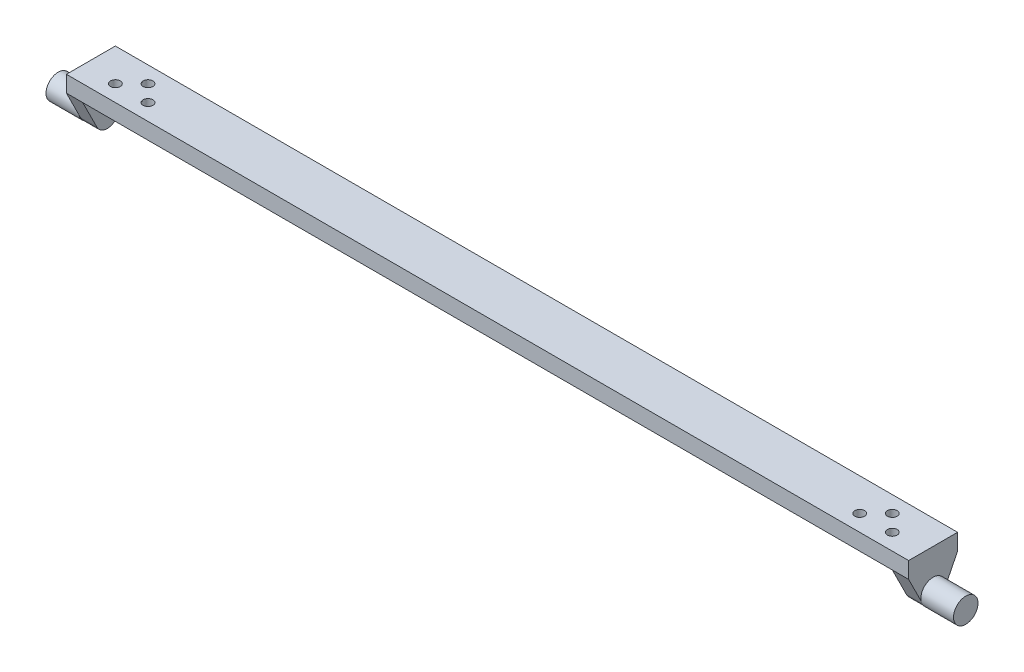
ISO-10303-21;
HEADER;
FILE_DESCRIPTION(('STEP AP214'),'2;1');
FILE_NAME('part.step','',(''),(''),'','','');
FILE_SCHEMA(('AUTOMOTIVE_DESIGN { 1 0 10303 214 1 1 1 1 }'));
ENDSEC;
DATA;
#1=APPLICATION_CONTEXT('core data for automotive mechanical design processes');
#2=APPLICATION_PROTOCOL_DEFINITION('international standard','automotive_design',2000,#1);
#3=PRODUCT_CONTEXT('',#1,'mechanical');
#4=PRODUCT('Part','Part','',(#3));
#5=PRODUCT_RELATED_PRODUCT_CATEGORY('part','',(#4));
#6=PRODUCT_DEFINITION_FORMATION('','',#4);
#7=PRODUCT_DEFINITION_CONTEXT('part definition',#1,'design');
#8=PRODUCT_DEFINITION('design','',#6,#7);
#9=PRODUCT_DEFINITION_SHAPE('','',#8);
#10=(LENGTH_UNIT() NAMED_UNIT(*) SI_UNIT(.MILLI.,.METRE.));
#11=(NAMED_UNIT(*) PLANE_ANGLE_UNIT() SI_UNIT($,.RADIAN.));
#12=(NAMED_UNIT(*) SI_UNIT($,.STERADIAN.) SOLID_ANGLE_UNIT());
#13=UNCERTAINTY_MEASURE_WITH_UNIT(LENGTH_MEASURE(1.E-05),#10,'distance_accuracy_value','');
#14=(GEOMETRIC_REPRESENTATION_CONTEXT(3) GLOBAL_UNCERTAINTY_ASSIGNED_CONTEXT((#13)) GLOBAL_UNIT_ASSIGNED_CONTEXT((#10,
#11,#12)) REPRESENTATION_CONTEXT('',''));
#15=CARTESIAN_POINT('',(0.,0.,0.));
#16=DIRECTION('',(0.,0.,1.));
#17=DIRECTION('',(1.,0.,0.));
#18=AXIS2_PLACEMENT_3D('',#15,#16,#17);
#19=CARTESIAN_POINT('',(-52.3880758683504,0.,0.));
#20=DIRECTION('',(1.,0.,0.));
#21=DIRECTION('',(0.,0.,-1.));
#22=AXIS2_PLACEMENT_3D('',#19,#20,#21);
#23=PLANE('',#22);
#24=CARTESIAN_POINT('',(-52.3880758683504,-6.92376207875074,7.16574015094486));
#25=DIRECTION('',(-1.,0.,0.));
#26=DIRECTION('',(0.,0.,1.));
#27=AXIS2_PLACEMENT_3D('',#24,#25,#26);
#28=CIRCLE('',#27,3.75);
#29=CARTESIAN_POINT('',(-52.3880758683504,-7.63684506255339,10.8473176196682));
#30=VERTEX_POINT('',#29);
#31=CARTESIAN_POINT('',(-52.3880758683504,-7.63684506255339,3.48416268222155));
#32=VERTEX_POINT('',#31);
#33=EDGE_CURVE('E11',#30,#32,#28,.T.);
#34=ORIENTED_EDGE('',*,*,#33,.F.);
#35=DIRECTION('',(0.,0.894427190999916,0.447213595499958));
#36=VECTOR('',#35,1.);
#37=CARTESIAN_POINT('',(-52.3880758683504,0.,14.6657401509449));
#38=LINE('',#37,#36);
#39=CARTESIAN_POINT('',(-52.3880758683504,0.,14.6657401509449));
#40=VERTEX_POINT('',#39);
#41=EDGE_CURVE('E137',#30,#40,#38,.T.);
#42=ORIENTED_EDGE('',*,*,#41,.T.);
#43=DIRECTION('',(0.,1.,0.));
#44=VECTOR('',#43,1.);
#45=CARTESIAN_POINT('',(-52.3880758683504,5.,14.6657401509449));
#46=LINE('',#45,#44);
#47=CARTESIAN_POINT('',(-52.3880758683504,5.,14.6657401509449));
#48=VERTEX_POINT('',#47);
#49=EDGE_CURVE('E162',#40,#48,#46,.T.);
#50=ORIENTED_EDGE('',*,*,#49,.T.);
#51=DIRECTION('',(0.,0.,-1.));
#52=VECTOR('',#51,1.);
#53=CARTESIAN_POINT('',(-52.3880758683504,5.,-0.33425984905514));
#54=LINE('',#53,#52);
#55=CARTESIAN_POINT('',(-52.3880758683504,5.,-0.33425984905514));
#56=VERTEX_POINT('',#55);
#57=EDGE_CURVE('E165',#48,#56,#54,.T.);
#58=ORIENTED_EDGE('',*,*,#57,.T.);
#59=DIRECTION('',(0.,-1.,0.));
#60=VECTOR('',#59,1.);
#61=CARTESIAN_POINT('',(-52.3880758683504,0.,-0.33425984905514));
#62=LINE('',#61,#60);
#63=CARTESIAN_POINT('',(-52.3880758683504,0.,-0.33425984905514));
#64=VERTEX_POINT('',#63);
#65=EDGE_CURVE('E133',#56,#64,#62,.T.);
#66=ORIENTED_EDGE('',*,*,#65,.T.);
#67=DIRECTION('',(0.,-0.894427190999916,0.447213595499958));
#68=VECTOR('',#67,1.);
#69=CARTESIAN_POINT('',(-52.3880758683504,-15.,7.16574015094486));
#70=LINE('',#69,#68);
#71=EDGE_CURVE('E129',#64,#32,#70,.T.);
#72=ORIENTED_EDGE('',*,*,#71,.T.);
#73=EDGE_LOOP('',(#34,#42,#50,#58,#66,#72));
#74=FACE_BOUND('',#73,.T.);
#75=ADVANCED_FACE('F33',(#74),#23,.F.);
#76=CARTESIAN_POINT('',(200.61192413165,5.,-0.334259849055131));
#77=DIRECTION('',(0.,0.,1.));
#78=DIRECTION('',(1.,0.,0.));
#79=AXIS2_PLACEMENT_3D('',#76,#77,#78);
#80=PLANE('',#79);
#81=DIRECTION('',(-1.,0.,0.));
#82=VECTOR('',#81,1.);
#83=CARTESIAN_POINT('',(200.61192413165,0.,-0.334259849055131));
#84=LINE('',#83,#82);
#85=CARTESIAN_POINT('',(200.61192413165,0.,-0.334259849055131));
#86=VERTEX_POINT('',#85);
#87=CARTESIAN_POINT('',(-47.3880758683504,0.,-0.33425984905514));
#88=VERTEX_POINT('',#87);
#89=EDGE_CURVE('E243',#86,#88,#84,.T.);
#90=ORIENTED_EDGE('',*,*,#89,.T.);
#91=DIRECTION('',(1.,0.,0.));
#92=VECTOR('',#91,1.);
#93=CARTESIAN_POINT('',(-52.3880758683504,0.,-0.33425984905514));
#94=LINE('',#93,#92);
#95=EDGE_CURVE('E168',#64,#88,#94,.T.);
#96=ORIENTED_EDGE('',*,*,#95,.F.);
#97=ORIENTED_EDGE('',*,*,#65,.F.);
#98=DIRECTION('',(-1.,0.,0.));
#99=VECTOR('',#98,1.);
#100=CARTESIAN_POINT('',(200.61192413165,5.,-0.334259849055131));
#101=LINE('',#100,#99);
#102=CARTESIAN_POINT('',(205.61192413165,5.,-0.334259849055131));
#103=VERTEX_POINT('',#102);
#104=EDGE_CURVE('E246',#103,#56,#101,.T.);
#105=ORIENTED_EDGE('',*,*,#104,.F.);
#106=DIRECTION('',(0.,1.,0.));
#107=VECTOR('',#106,1.);
#108=CARTESIAN_POINT('',(205.61192413165,0.,-0.334259849055131));
#109=LINE('',#108,#107);
#110=CARTESIAN_POINT('',(205.61192413165,0.,-0.334259849055131));
#111=VERTEX_POINT('',#110);
#112=EDGE_CURVE('E187',#111,#103,#109,.T.);
#113=ORIENTED_EDGE('',*,*,#112,.F.);
#114=DIRECTION('',(-1.,0.,0.));
#115=VECTOR('',#114,1.);
#116=CARTESIAN_POINT('',(205.61192413165,0.,-0.334259849055131));
#117=LINE('',#116,#115);
#118=EDGE_CURVE('E206',#111,#86,#117,.T.);
#119=ORIENTED_EDGE('',*,*,#118,.T.);
#120=EDGE_LOOP('',(#90,#96,#97,#105,#113,#119));
#121=FACE_BOUND('',#120,.T.);
#122=ADVANCED_FACE('F285',(#121),#80,.F.);
#123=CARTESIAN_POINT('',(-47.3880758683504,5.,14.6657401509449));
#124=DIRECTION('',(0.,0.,-1.));
#125=DIRECTION('',(-1.,0.,0.));
#126=AXIS2_PLACEMENT_3D('',#123,#124,#125);
#127=PLANE('',#126);
#128=DIRECTION('',(1.,0.,0.));
#129=VECTOR('',#128,1.);
#130=CARTESIAN_POINT('',(-47.3880758683504,0.,14.6657401509449));
#131=LINE('',#130,#129);
#132=CARTESIAN_POINT('',(-47.3880758683504,0.,14.6657401509449));
#133=VERTEX_POINT('',#132);
#134=CARTESIAN_POINT('',(200.61192413165,0.,14.6657401509449));
#135=VERTEX_POINT('',#134);
#136=EDGE_CURVE('E257',#133,#135,#131,.T.);
#137=ORIENTED_EDGE('',*,*,#136,.T.);
#138=DIRECTION('',(-1.,0.,0.));
#139=VECTOR('',#138,1.);
#140=CARTESIAN_POINT('',(205.61192413165,0.,14.6657401509449));
#141=LINE('',#140,#139);
#142=CARTESIAN_POINT('',(205.61192413165,0.,14.6657401509449));
#143=VERTEX_POINT('',#142);
#144=EDGE_CURVE('E199',#143,#135,#141,.T.);
#145=ORIENTED_EDGE('',*,*,#144,.F.);
#146=DIRECTION('',(0.,-1.,0.));
#147=VECTOR('',#146,1.);
#148=CARTESIAN_POINT('',(205.61192413165,5.,14.6657401509449));
#149=LINE('',#148,#147);
#150=CARTESIAN_POINT('',(205.61192413165,5.,14.6657401509449));
#151=VERTEX_POINT('',#150);
#152=EDGE_CURVE('E194',#151,#143,#149,.T.);
#153=ORIENTED_EDGE('',*,*,#152,.F.);
#154=DIRECTION('',(1.,0.,0.));
#155=VECTOR('',#154,1.);
#156=CARTESIAN_POINT('',(-47.3880758683504,5.,14.6657401509449));
#157=LINE('',#156,#155);
#158=EDGE_CURVE('E248',#48,#151,#157,.T.);
#159=ORIENTED_EDGE('',*,*,#158,.F.);
#160=ORIENTED_EDGE('',*,*,#49,.F.);
#161=DIRECTION('',(1.,0.,0.));
#162=VECTOR('',#161,1.);
#163=CARTESIAN_POINT('',(-52.3880758683504,0.,14.6657401509449));
#164=LINE('',#163,#162);
#165=EDGE_CURVE('E172',#40,#133,#164,.T.);
#166=ORIENTED_EDGE('',*,*,#165,.T.);
#167=EDGE_LOOP('',(#137,#145,#153,#159,#160,#166));
#168=FACE_BOUND('',#167,.T.);
#169=ADVANCED_FACE('F340',(#168),#127,.F.);
#170=CARTESIAN_POINT('',(0.,5.,0.));
#171=DIRECTION('',(0.,1.,0.));
#172=DIRECTION('',(0.,0.,1.));
#173=AXIS2_PLACEMENT_3D('',#170,#171,#172);
#174=PLANE('',#173);
#175=CARTESIAN_POINT('',(195.61192413165,5.,9.66574015094486));
#176=DIRECTION('',(0.,1.,0.));
#177=DIRECTION('',(0.,0.,1.));
#178=AXIS2_PLACEMENT_3D('',#175,#176,#177);
#179=CIRCLE('',#178,1.5);
#180=CARTESIAN_POINT('',(195.61192413165,5.,11.1657401509449));
#181=VERTEX_POINT('',#180);
#182=EDGE_CURVE('E209',#181,#181,#179,.T.);
#183=ORIENTED_EDGE('',*,*,#182,.F.);
#184=EDGE_LOOP('',(#183));
#185=FACE_BOUND('',#184,.T.);
#186=CARTESIAN_POINT('',(190.61192413165,5.,4.66574015094487));
#187=DIRECTION('',(0.,1.,0.));
#188=DIRECTION('',(0.,0.,1.));
#189=AXIS2_PLACEMENT_3D('',#186,#187,#188);
#190=CIRCLE('',#189,1.5);
#191=CARTESIAN_POINT('',(190.61192413165,5.,6.16574015094487));
#192=VERTEX_POINT('',#191);
#193=EDGE_CURVE('E213',#192,#192,#190,.T.);
#194=ORIENTED_EDGE('',*,*,#193,.F.);
#195=EDGE_LOOP('',(#194));
#196=FACE_BOUND('',#195,.T.);
#197=CARTESIAN_POINT('',(185.61192413165,5.,9.66574015094486));
#198=DIRECTION('',(0.,1.,0.));
#199=DIRECTION('',(0.,0.,1.));
#200=AXIS2_PLACEMENT_3D('',#197,#198,#199);
#201=CIRCLE('',#200,1.5);
#202=CARTESIAN_POINT('',(185.61192413165,5.,11.1657401509449));
#203=VERTEX_POINT('',#202);
#204=EDGE_CURVE('E219',#203,#203,#201,.T.);
#205=ORIENTED_EDGE('',*,*,#204,.F.);
#206=EDGE_LOOP('',(#205));
#207=FACE_BOUND('',#206,.T.);
#208=CARTESIAN_POINT('',(-32.3880758683504,5.,9.66574015094486));
#209=DIRECTION('',(0.,1.,0.));
#210=DIRECTION('',(0.,0.,1.));
#211=AXIS2_PLACEMENT_3D('',#208,#209,#210);
#212=CIRCLE('',#211,1.5);
#213=CARTESIAN_POINT('',(-32.3880758683504,5.,11.1657401509449));
#214=VERTEX_POINT('',#213);
#215=EDGE_CURVE('E225',#214,#214,#212,.T.);
#216=ORIENTED_EDGE('',*,*,#215,.F.);
#217=EDGE_LOOP('',(#216));
#218=FACE_BOUND('',#217,.T.);
#219=CARTESIAN_POINT('',(-37.3880758683504,5.,4.66574015094487));
#220=DIRECTION('',(0.,1.,0.));
#221=DIRECTION('',(0.,0.,1.));
#222=AXIS2_PLACEMENT_3D('',#219,#220,#221);
#223=CIRCLE('',#222,1.5);
#224=CARTESIAN_POINT('',(-37.3880758683504,5.,6.16574015094487));
#225=VERTEX_POINT('',#224);
#226=EDGE_CURVE('E231',#225,#225,#223,.T.);
#227=ORIENTED_EDGE('',*,*,#226,.F.);
#228=EDGE_LOOP('',(#227));
#229=FACE_BOUND('',#228,.T.);
#230=CARTESIAN_POINT('',(-42.3880758683504,5.,9.66574015094486));
#231=DIRECTION('',(0.,1.,0.));
#232=DIRECTION('',(0.,0.,1.));
#233=AXIS2_PLACEMENT_3D('',#230,#231,#232);
#234=CIRCLE('',#233,1.5);
#235=CARTESIAN_POINT('',(-42.3880758683504,5.,11.1657401509449));
#236=VERTEX_POINT('',#235);
#237=EDGE_CURVE('E237',#236,#236,#234,.T.);
#238=ORIENTED_EDGE('',*,*,#237,.F.);
#239=EDGE_LOOP('',(#238));
#240=FACE_BOUND('',#239,.T.);
#241=ORIENTED_EDGE('',*,*,#104,.T.);
#242=ORIENTED_EDGE('',*,*,#57,.F.);
#243=ORIENTED_EDGE('',*,*,#158,.T.);
#244=DIRECTION('',(0.,0.,1.));
#245=VECTOR('',#244,1.);
#246=CARTESIAN_POINT('',(205.61192413165,5.,-0.334259849055131));
#247=LINE('',#246,#245);
#248=EDGE_CURVE('E191',#103,#151,#247,.T.);
#249=ORIENTED_EDGE('',*,*,#248,.F.);
#250=EDGE_LOOP('',(#241,#242,#243,#249));
#251=FACE_BOUND('',#250,.T.);
#252=ADVANCED_FACE('F423',(#185,#196,#207,#218,#229,#240,#251),#174,.T.);
#253=CARTESIAN_POINT('',(0.,0.,0.));
#254=DIRECTION('',(0.,1.,0.));
#255=DIRECTION('',(0.,0.,1.));
#256=AXIS2_PLACEMENT_3D('',#253,#254,#255);
#257=PLANE('',#256);
#258=CARTESIAN_POINT('',(195.61192413165,0.,9.66574015094486));
#259=DIRECTION('',(0.,1.,0.));
#260=DIRECTION('',(0.,0.,1.));
#261=AXIS2_PLACEMENT_3D('',#258,#259,#260);
#262=CIRCLE('',#261,1.5);
#263=CARTESIAN_POINT('',(195.61192413165,0.,11.1657401509449));
#264=VERTEX_POINT('',#263);
#265=EDGE_CURVE('E210',#264,#264,#262,.T.);
#266=ORIENTED_EDGE('',*,*,#265,.T.);
#267=EDGE_LOOP('',(#266));
#268=FACE_BOUND('',#267,.T.);
#269=CARTESIAN_POINT('',(190.61192413165,0.,4.66574015094487));
#270=DIRECTION('',(0.,1.,0.));
#271=DIRECTION('',(0.,0.,1.));
#272=AXIS2_PLACEMENT_3D('',#269,#270,#271);
#273=CIRCLE('',#272,1.5);
#274=CARTESIAN_POINT('',(190.61192413165,0.,6.16574015094487));
#275=VERTEX_POINT('',#274);
#276=EDGE_CURVE('E216',#275,#275,#273,.T.);
#277=ORIENTED_EDGE('',*,*,#276,.T.);
#278=EDGE_LOOP('',(#277));
#279=FACE_BOUND('',#278,.T.);
#280=CARTESIAN_POINT('',(185.61192413165,0.,9.66574015094486));
#281=DIRECTION('',(0.,1.,0.));
#282=DIRECTION('',(0.,0.,1.));
#283=AXIS2_PLACEMENT_3D('',#280,#281,#282);
#284=CIRCLE('',#283,1.5);
#285=CARTESIAN_POINT('',(185.61192413165,0.,11.1657401509449));
#286=VERTEX_POINT('',#285);
#287=EDGE_CURVE('E222',#286,#286,#284,.T.);
#288=ORIENTED_EDGE('',*,*,#287,.T.);
#289=EDGE_LOOP('',(#288));
#290=FACE_BOUND('',#289,.T.);
#291=CARTESIAN_POINT('',(-32.3880758683504,0.,9.66574015094486));
#292=DIRECTION('',(0.,1.,0.));
#293=DIRECTION('',(0.,0.,1.));
#294=AXIS2_PLACEMENT_3D('',#291,#292,#293);
#295=CIRCLE('',#294,1.5);
#296=CARTESIAN_POINT('',(-32.3880758683504,0.,11.1657401509449));
#297=VERTEX_POINT('',#296);
#298=EDGE_CURVE('E228',#297,#297,#295,.T.);
#299=ORIENTED_EDGE('',*,*,#298,.T.);
#300=EDGE_LOOP('',(#299));
#301=FACE_BOUND('',#300,.T.);
#302=CARTESIAN_POINT('',(-37.3880758683504,0.,4.66574015094487));
#303=DIRECTION('',(0.,1.,0.));
#304=DIRECTION('',(0.,0.,1.));
#305=AXIS2_PLACEMENT_3D('',#302,#303,#304);
#306=CIRCLE('',#305,1.5);
#307=CARTESIAN_POINT('',(-37.3880758683504,0.,6.16574015094487));
#308=VERTEX_POINT('',#307);
#309=EDGE_CURVE('E234',#308,#308,#306,.T.);
#310=ORIENTED_EDGE('',*,*,#309,.T.);
#311=EDGE_LOOP('',(#310));
#312=FACE_BOUND('',#311,.T.);
#313=CARTESIAN_POINT('',(-42.3880758683504,0.,9.66574015094486));
#314=DIRECTION('',(0.,1.,0.));
#315=DIRECTION('',(0.,0.,1.));
#316=AXIS2_PLACEMENT_3D('',#313,#314,#315);
#317=CIRCLE('',#316,1.5);
#318=CARTESIAN_POINT('',(-42.3880758683504,0.,11.1657401509449));
#319=VERTEX_POINT('',#318);
#320=EDGE_CURVE('E240',#319,#319,#317,.T.);
#321=ORIENTED_EDGE('',*,*,#320,.T.);
#322=EDGE_LOOP('',(#321));
#323=FACE_BOUND('',#322,.T.);
#324=ORIENTED_EDGE('',*,*,#89,.F.);
#325=DIRECTION('',(0.,0.,-1.));
#326=VECTOR('',#325,1.);
#327=CARTESIAN_POINT('',(200.61192413165,0.,14.6657401509449));
#328=LINE('',#327,#326);
#329=EDGE_CURVE('E249',#135,#86,#328,.T.);
#330=ORIENTED_EDGE('',*,*,#329,.F.);
#331=ORIENTED_EDGE('',*,*,#136,.F.);
#332=DIRECTION('',(0.,0.,1.));
#333=VECTOR('',#332,1.);
#334=CARTESIAN_POINT('',(-47.3880758683504,0.,-0.33425984905514));
#335=LINE('',#334,#333);
#336=EDGE_CURVE('E254',#88,#133,#335,.T.);
#337=ORIENTED_EDGE('',*,*,#336,.F.);
#338=EDGE_LOOP('',(#324,#330,#331,#337));
#339=FACE_BOUND('',#338,.T.);
#340=ADVANCED_FACE('F291',(#268,#279,#290,#301,#312,#323,#339),#257,.F.);
#341=CARTESIAN_POINT('',(-42.3880758683504,0.,9.66574015094486));
#342=DIRECTION('',(0.,1.,0.));
#343=DIRECTION('',(0.,0.,1.));
#344=AXIS2_PLACEMENT_3D('',#341,#342,#343);
#345=CYLINDRICAL_SURFACE('',#344,1.5);
#346=ORIENTED_EDGE('',*,*,#320,.F.);
#347=EDGE_LOOP('',(#346));
#348=FACE_BOUND('',#347,.T.);
#349=ORIENTED_EDGE('',*,*,#237,.T.);
#350=EDGE_LOOP('',(#349));
#351=FACE_BOUND('',#350,.T.);
#352=ADVANCED_FACE('F550',(#348,#351),#345,.F.);
#353=CARTESIAN_POINT('',(-37.3880758683504,0.,4.66574015094487));
#354=DIRECTION('',(0.,1.,0.));
#355=DIRECTION('',(0.,0.,1.));
#356=AXIS2_PLACEMENT_3D('',#353,#354,#355);
#357=CYLINDRICAL_SURFACE('',#356,1.5);
#358=ORIENTED_EDGE('',*,*,#309,.F.);
#359=EDGE_LOOP('',(#358));
#360=FACE_BOUND('',#359,.T.);
#361=ORIENTED_EDGE('',*,*,#226,.T.);
#362=EDGE_LOOP('',(#361));
#363=FACE_BOUND('',#362,.T.);
#364=ADVANCED_FACE('F540',(#360,#363),#357,.F.);
#365=CARTESIAN_POINT('',(-32.3880758683504,0.,9.66574015094486));
#366=DIRECTION('',(0.,1.,0.));
#367=DIRECTION('',(0.,0.,1.));
#368=AXIS2_PLACEMENT_3D('',#365,#366,#367);
#369=CYLINDRICAL_SURFACE('',#368,1.5);
#370=ORIENTED_EDGE('',*,*,#298,.F.);
#371=EDGE_LOOP('',(#370));
#372=FACE_BOUND('',#371,.T.);
#373=ORIENTED_EDGE('',*,*,#215,.T.);
#374=EDGE_LOOP('',(#373));
#375=FACE_BOUND('',#374,.T.);
#376=ADVANCED_FACE('F530',(#372,#375),#369,.F.);
#377=CARTESIAN_POINT('',(185.61192413165,0.,9.66574015094486));
#378=DIRECTION('',(0.,1.,0.));
#379=DIRECTION('',(0.,0.,1.));
#380=AXIS2_PLACEMENT_3D('',#377,#378,#379);
#381=CYLINDRICAL_SURFACE('',#380,1.5);
#382=ORIENTED_EDGE('',*,*,#287,.F.);
#383=EDGE_LOOP('',(#382));
#384=FACE_BOUND('',#383,.T.);
#385=ORIENTED_EDGE('',*,*,#204,.T.);
#386=EDGE_LOOP('',(#385));
#387=FACE_BOUND('',#386,.T.);
#388=ADVANCED_FACE('F520',(#384,#387),#381,.F.);
#389=CARTESIAN_POINT('',(190.61192413165,0.,4.66574015094487));
#390=DIRECTION('',(0.,1.,0.));
#391=DIRECTION('',(0.,0.,1.));
#392=AXIS2_PLACEMENT_3D('',#389,#390,#391);
#393=CYLINDRICAL_SURFACE('',#392,1.5);
#394=ORIENTED_EDGE('',*,*,#276,.F.);
#395=EDGE_LOOP('',(#394));
#396=FACE_BOUND('',#395,.T.);
#397=ORIENTED_EDGE('',*,*,#193,.T.);
#398=EDGE_LOOP('',(#397));
#399=FACE_BOUND('',#398,.T.);
#400=ADVANCED_FACE('F510',(#396,#399),#393,.F.);
#401=CARTESIAN_POINT('',(195.61192413165,0.,9.66574015094486));
#402=DIRECTION('',(0.,1.,0.));
#403=DIRECTION('',(0.,0.,1.));
#404=AXIS2_PLACEMENT_3D('',#401,#402,#403);
#405=CYLINDRICAL_SURFACE('',#404,1.5);
#406=ORIENTED_EDGE('',*,*,#265,.F.);
#407=EDGE_LOOP('',(#406));
#408=FACE_BOUND('',#407,.T.);
#409=ORIENTED_EDGE('',*,*,#182,.T.);
#410=EDGE_LOOP('',(#409));
#411=FACE_BOUND('',#410,.T.);
#412=ADVANCED_FACE('F503',(#408,#411),#405,.F.);
#413=CARTESIAN_POINT('',(200.61192413165,0.,0.));
#414=DIRECTION('',(1.,0.,0.));
#415=DIRECTION('',(0.,0.,-1.));
#416=AXIS2_PLACEMENT_3D('',#413,#414,#415);
#417=PLANE('',#416);
#418=DIRECTION('',(0.,0.894427190999916,-0.447213595499958));
#419=VECTOR('',#418,1.);
#420=CARTESIAN_POINT('',(200.61192413165,-15.,7.16574015094487));
#421=LINE('',#420,#419);
#422=CARTESIAN_POINT('',(200.61192413165,-8.73900966300059,4.03524498244516));
#423=VERTEX_POINT('',#422);
#424=EDGE_CURVE('E179',#423,#86,#421,.T.);
#425=ORIENTED_EDGE('',*,*,#424,.F.);
#426=CARTESIAN_POINT('',(200.61192413165,-7.17376207875073,7.16574015094487));
#427=DIRECTION('',(1.,0.,0.));
#428=DIRECTION('',(0.,0.,-1.));
#429=AXIS2_PLACEMENT_3D('',#426,#427,#428);
#430=CIRCLE('',#429,3.5);
#431=CARTESIAN_POINT('',(200.61192413165,-8.73900966300059,10.2962353194446));
#432=VERTEX_POINT('',#431);
#433=EDGE_CURVE('E263',#423,#432,#430,.F.);
#434=ORIENTED_EDGE('',*,*,#433,.T.);
#435=DIRECTION('',(0.,-0.894427190999916,-0.447213595499958));
#436=VECTOR('',#435,1.);
#437=CARTESIAN_POINT('',(200.61192413165,0.,14.6657401509449));
#438=LINE('',#437,#436);
#439=EDGE_CURVE('E201',#135,#432,#438,.T.);
#440=ORIENTED_EDGE('',*,*,#439,.F.);
#441=ORIENTED_EDGE('',*,*,#329,.T.);
#442=EDGE_LOOP('',(#425,#434,#440,#441));
#443=FACE_BOUND('',#442,.T.);
#444=ADVANCED_FACE('F296',(#443),#417,.F.);
#445=CARTESIAN_POINT('',(205.61192413165,-15.,7.16574015094487));
#446=DIRECTION('',(0.,0.447213595499958,0.894427190999916));
#447=DIRECTION('',(0.,-0.894427190999916,0.447213595499958));
#448=AXIS2_PLACEMENT_3D('',#445,#446,#447);
#449=PLANE('',#448);
#450=DIRECTION('',(0.,0.894427190999916,-0.447213595499958));
#451=VECTOR('',#450,1.);
#452=CARTESIAN_POINT('',(205.61192413165,-15.,7.16574015094487));
#453=LINE('',#452,#451);
#454=CARTESIAN_POINT('',(205.61192413165,-8.73900966300059,4.03524498244516));
#455=VERTEX_POINT('',#454);
#456=CARTESIAN_POINT('',(205.61192413165,-7.63684506255339,3.48416268222156));
#457=VERTEX_POINT('',#456);
#458=EDGE_CURVE('E184',#455,#457,#453,.T.);
#459=ORIENTED_EDGE('',*,*,#458,.F.);
#460=DIRECTION('',(-1.,0.,0.));
#461=VECTOR('',#460,1.);
#462=CARTESIAN_POINT('',(205.61192413165,-8.73900966300059,4.03524498244516));
#463=LINE('',#462,#461);
#464=EDGE_CURVE('E251',#455,#423,#463,.T.);
#465=ORIENTED_EDGE('',*,*,#464,.T.);
#466=ORIENTED_EDGE('',*,*,#424,.T.);
#467=ORIENTED_EDGE('',*,*,#118,.F.);
#468=EDGE_CURVE('E188',#457,#111,#453,.T.);
#469=ORIENTED_EDGE('',*,*,#468,.F.);
#470=EDGE_LOOP('',(#459,#465,#466,#467,#469));
#471=FACE_BOUND('',#470,.T.);
#472=ADVANCED_FACE('F321',(#471),#449,.F.);
#473=CARTESIAN_POINT('',(205.61192413165,0.,14.6657401509449));
#474=DIRECTION('',(0.,0.447213595499958,-0.894427190999916));
#475=DIRECTION('',(0.,0.894427190999916,0.447213595499958));
#476=AXIS2_PLACEMENT_3D('',#473,#474,#475);
#477=PLANE('',#476);
#478=ORIENTED_EDGE('',*,*,#439,.T.);
#479=DIRECTION('',(-1.,0.,0.));
#480=VECTOR('',#479,1.);
#481=CARTESIAN_POINT('',(205.61192413165,-8.73900966300059,10.2962353194446));
#482=LINE('',#481,#480);
#483=CARTESIAN_POINT('',(205.61192413165,-8.73900966300059,10.2962353194446));
#484=VERTEX_POINT('',#483);
#485=EDGE_CURVE('E265',#432,#484,#482,.F.);
#486=ORIENTED_EDGE('',*,*,#485,.T.);
#487=DIRECTION('',(0.,-0.894427190999916,-0.447213595499958));
#488=VECTOR('',#487,1.);
#489=CARTESIAN_POINT('',(205.61192413165,0.,14.6657401509449));
#490=LINE('',#489,#488);
#491=CARTESIAN_POINT('',(205.61192413165,-7.63684506255339,10.8473176196682));
#492=VERTEX_POINT('',#491);
#493=EDGE_CURVE('E196',#492,#484,#490,.T.);
#494=ORIENTED_EDGE('',*,*,#493,.F.);
#495=EDGE_CURVE('E197',#143,#492,#490,.T.);
#496=ORIENTED_EDGE('',*,*,#495,.F.);
#497=ORIENTED_EDGE('',*,*,#144,.T.);
#498=EDGE_LOOP('',(#478,#486,#494,#496,#497));
#499=FACE_BOUND('',#498,.T.);
#500=ADVANCED_FACE('F299',(#499),#477,.F.);
#501=CARTESIAN_POINT('',(205.61192413165,0.,0.));
#502=DIRECTION('',(1.,0.,0.));
#503=DIRECTION('',(0.,0.,-1.));
#504=AXIS2_PLACEMENT_3D('',#501,#502,#503);
#505=PLANE('',#504);
#506=CARTESIAN_POINT('',(205.61192413165,-6.92376207875073,7.16574015094487));
#507=DIRECTION('',(1.,0.,0.));
#508=DIRECTION('',(0.,0.,-1.));
#509=AXIS2_PLACEMENT_3D('',#506,#507,#508);
#510=CIRCLE('',#509,3.75);
#511=EDGE_CURVE('E183',#457,#492,#510,.T.);
#512=ORIENTED_EDGE('',*,*,#511,.F.);
#513=ORIENTED_EDGE('',*,*,#468,.T.);
#514=ORIENTED_EDGE('',*,*,#112,.T.);
#515=ORIENTED_EDGE('',*,*,#248,.T.);
#516=ORIENTED_EDGE('',*,*,#152,.T.);
#517=ORIENTED_EDGE('',*,*,#495,.T.);
#518=EDGE_LOOP('',(#512,#513,#514,#515,#516,#517));
#519=FACE_BOUND('',#518,.T.);
#520=ADVANCED_FACE('F319',(#519),#505,.T.);
#521=CARTESIAN_POINT('',(205.61192413165,-7.17376207875073,7.16574015094487));
#522=DIRECTION('',(-1.,0.,0.));
#523=DIRECTION('',(0.,0.,1.));
#524=AXIS2_PLACEMENT_3D('',#521,#522,#523);
#525=CYLINDRICAL_SURFACE('',#524,3.5);
#526=CARTESIAN_POINT('',(205.61192413165,-7.17376207875073,7.16574015094487));
#527=DIRECTION('',(1.,0.,0.));
#528=DIRECTION('',(0.,0.,-1.));
#529=AXIS2_PLACEMENT_3D('',#526,#527,#528);
#530=CIRCLE('',#529,3.5);
#531=CARTESIAN_POINT('',(205.61192413165,-10.6737620787507,7.16574015094488));
#532=VERTEX_POINT('',#531);
#533=EDGE_CURVE('E268',#484,#532,#530,.T.);
#534=ORIENTED_EDGE('',*,*,#533,.F.);
#535=ORIENTED_EDGE('',*,*,#485,.F.);
#536=ORIENTED_EDGE('',*,*,#433,.F.);
#537=ORIENTED_EDGE('',*,*,#464,.F.);
#538=EDGE_CURVE('E267',#532,#455,#530,.T.);
#539=ORIENTED_EDGE('',*,*,#538,.F.);
#540=EDGE_LOOP('',(#534,#535,#536,#537,#539));
#541=FACE_BOUND('',#540,.T.);
#542=ADVANCED_FACE('F305',(#541),#525,.T.);
#543=CARTESIAN_POINT('',(205.61192413165,-6.92376207875073,7.16574015094487));
#544=DIRECTION('',(1.,0.,0.));
#545=DIRECTION('',(0.,0.,-1.));
#546=AXIS2_PLACEMENT_3D('',#543,#544,#545);
#547=PLANE('',#546);
#548=EDGE_CURVE('E180',#492,#532,#510,.T.);
#549=ORIENTED_EDGE('',*,*,#548,.F.);
#550=ORIENTED_EDGE('',*,*,#493,.T.);
#551=ORIENTED_EDGE('',*,*,#533,.T.);
#552=EDGE_LOOP('',(#549,#550,#551));
#553=FACE_BOUND('',#552,.T.);
#554=ADVANCED_FACE('F312',(#553),#547,.F.);
#555=EDGE_CURVE('E175',#532,#457,#510,.T.);
#556=ORIENTED_EDGE('',*,*,#555,.F.);
#557=ORIENTED_EDGE('',*,*,#538,.T.);
#558=ORIENTED_EDGE('',*,*,#458,.T.);
#559=EDGE_LOOP('',(#556,#557,#558));
#560=FACE_BOUND('',#559,.T.);
#561=ADVANCED_FACE('F323',(#560),#547,.F.);
#562=CARTESIAN_POINT('',(215.61192413165,-6.92376207875073,7.16574015094487));
#563=DIRECTION('',(-1.,0.,0.));
#564=DIRECTION('',(0.,0.,1.));
#565=AXIS2_PLACEMENT_3D('',#562,#563,#564);
#566=CYLINDRICAL_SURFACE('',#565,3.75);
#567=CARTESIAN_POINT('',(215.61192413165,-6.92376207875073,7.16574015094487));
#568=DIRECTION('',(1.,0.,0.));
#569=DIRECTION('',(0.,0.,-1.));
#570=AXIS2_PLACEMENT_3D('',#567,#568,#569);
#571=CIRCLE('',#570,3.75);
#572=CARTESIAN_POINT('',(215.61192413165,-6.92376207875073,3.41574015094487));
#573=VERTEX_POINT('',#572);
#574=EDGE_CURVE('E176',#573,#573,#571,.T.);
#575=ORIENTED_EDGE('',*,*,#574,.F.);
#576=EDGE_LOOP('',(#575));
#577=FACE_BOUND('',#576,.T.);
#578=ORIENTED_EDGE('',*,*,#548,.T.);
#579=ORIENTED_EDGE('',*,*,#555,.T.);
#580=ORIENTED_EDGE('',*,*,#511,.T.);
#581=EDGE_LOOP('',(#578,#579,#580));
#582=FACE_BOUND('',#581,.T.);
#583=ADVANCED_FACE('F316',(#577,#582),#566,.T.);
#584=CARTESIAN_POINT('',(215.61192413165,-6.92376207875073,7.16574015094487));
#585=DIRECTION('',(1.,0.,0.));
#586=DIRECTION('',(0.,0.,-1.));
#587=AXIS2_PLACEMENT_3D('',#584,#585,#586);
#588=PLANE('',#587);
#589=ORIENTED_EDGE('',*,*,#574,.T.);
#590=EDGE_LOOP('',(#589));
#591=FACE_BOUND('',#590,.T.);
#592=ADVANCED_FACE('F330',(#591),#588,.T.);
#593=CARTESIAN_POINT('',(-52.3880758683504,-15.,7.16574015094486));
#594=DIRECTION('',(0.,0.447213595499958,0.894427190999916));
#595=DIRECTION('',(0.,-0.894427190999916,0.447213595499958));
#596=AXIS2_PLACEMENT_3D('',#593,#594,#595);
#597=PLANE('',#596);
#598=DIRECTION('',(0.,-0.894427190999916,0.447213595499958));
#599=VECTOR('',#598,1.);
#600=CARTESIAN_POINT('',(-47.3880758683504,-15.,7.16574015094486));
#601=LINE('',#600,#599);
#602=CARTESIAN_POINT('',(-47.3880758683504,-8.73900966300059,4.03524498244515));
#603=VERTEX_POINT('',#602);
#604=EDGE_CURVE('E156',#88,#603,#601,.T.);
#605=ORIENTED_EDGE('',*,*,#604,.T.);
#606=DIRECTION('',(1.,0.,0.));
#607=VECTOR('',#606,1.);
#608=CARTESIAN_POINT('',(-52.3880758683504,-8.73900966300059,4.03524498244515));
#609=LINE('',#608,#607);
#610=CARTESIAN_POINT('',(-52.3880758683504,-8.73900966300059,4.03524498244515));
#611=VERTEX_POINT('',#610);
#612=EDGE_CURVE('E144',#603,#611,#609,.F.);
#613=ORIENTED_EDGE('',*,*,#612,.T.);
#614=EDGE_CURVE('E138',#32,#611,#70,.T.);
#615=ORIENTED_EDGE('',*,*,#614,.F.);
#616=ORIENTED_EDGE('',*,*,#71,.F.);
#617=ORIENTED_EDGE('',*,*,#95,.T.);
#618=EDGE_LOOP('',(#605,#613,#615,#616,#617));
#619=FACE_BOUND('',#618,.T.);
#620=ADVANCED_FACE('F142',(#619),#597,.F.);
#621=CARTESIAN_POINT('',(-52.3880758683504,0.,14.6657401509449));
#622=DIRECTION('',(0.,0.447213595499958,-0.894427190999916));
#623=DIRECTION('',(0.,0.894427190999916,0.447213595499958));
#624=AXIS2_PLACEMENT_3D('',#621,#622,#623);
#625=PLANE('',#624);
#626=CARTESIAN_POINT('',(-52.3880758683504,-8.73900966300059,10.2962353194446));
#627=VERTEX_POINT('',#626);
#628=EDGE_CURVE('E159',#627,#30,#38,.T.);
#629=ORIENTED_EDGE('',*,*,#628,.F.);
#630=DIRECTION('',(1.,0.,0.));
#631=VECTOR('',#630,1.);
#632=CARTESIAN_POINT('',(-52.3880758683504,-8.73900966300059,10.2962353194446));
#633=LINE('',#632,#631);
#634=CARTESIAN_POINT('',(-47.3880758683504,-8.73900966300059,10.2962353194446));
#635=VERTEX_POINT('',#634);
#636=EDGE_CURVE('E271',#627,#635,#633,.T.);
#637=ORIENTED_EDGE('',*,*,#636,.T.);
#638=DIRECTION('',(0.,0.894427190999916,0.447213595499958));
#639=VECTOR('',#638,1.);
#640=CARTESIAN_POINT('',(-47.3880758683504,0.,14.6657401509449));
#641=LINE('',#640,#639);
#642=EDGE_CURVE('E147',#635,#133,#641,.T.);
#643=ORIENTED_EDGE('',*,*,#642,.T.);
#644=ORIENTED_EDGE('',*,*,#165,.F.);
#645=ORIENTED_EDGE('',*,*,#41,.F.);
#646=EDGE_LOOP('',(#629,#637,#643,#644,#645));
#647=FACE_BOUND('',#646,.T.);
#648=ADVANCED_FACE('F278',(#647),#625,.F.);
#649=CARTESIAN_POINT('',(-47.3880758683504,0.,0.));
#650=DIRECTION('',(1.,0.,0.));
#651=DIRECTION('',(0.,0.,-1.));
#652=AXIS2_PLACEMENT_3D('',#649,#650,#651);
#653=PLANE('',#652);
#654=ORIENTED_EDGE('',*,*,#642,.F.);
#655=CARTESIAN_POINT('',(-47.3880758683504,-7.17376207875074,7.16574015094486));
#656=DIRECTION('',(1.,0.,0.));
#657=DIRECTION('',(0.,0.,-1.));
#658=AXIS2_PLACEMENT_3D('',#655,#656,#657);
#659=CIRCLE('',#658,3.5);
#660=EDGE_CURVE('E274',#635,#603,#659,.T.);
#661=ORIENTED_EDGE('',*,*,#660,.T.);
#662=ORIENTED_EDGE('',*,*,#604,.F.);
#663=ORIENTED_EDGE('',*,*,#336,.T.);
#664=EDGE_LOOP('',(#654,#661,#662,#663));
#665=FACE_BOUND('',#664,.T.);
#666=ADVANCED_FACE('F283',(#665),#653,.T.);
#667=CARTESIAN_POINT('',(-52.3880758683504,-7.17376207875074,7.16574015094486));
#668=DIRECTION('',(1.,0.,0.));
#669=DIRECTION('',(0.,0.,-1.));
#670=AXIS2_PLACEMENT_3D('',#667,#668,#669);
#671=CYLINDRICAL_SURFACE('',#670,3.5);
#672=CARTESIAN_POINT('',(-52.3880758683504,-7.17376207875074,7.16574015094486));
#673=DIRECTION('',(1.,0.,0.));
#674=DIRECTION('',(0.,0.,-1.));
#675=AXIS2_PLACEMENT_3D('',#672,#673,#674);
#676=CIRCLE('',#675,3.5);
#677=CARTESIAN_POINT('',(-52.3880758683504,-10.6737620787507,7.16574015094486));
#678=VERTEX_POINT('',#677);
#679=EDGE_CURVE('E37',#611,#678,#676,.F.);
#680=ORIENTED_EDGE('',*,*,#679,.F.);
#681=ORIENTED_EDGE('',*,*,#612,.F.);
#682=ORIENTED_EDGE('',*,*,#660,.F.);
#683=ORIENTED_EDGE('',*,*,#636,.F.);
#684=EDGE_CURVE('E57',#678,#627,#676,.F.);
#685=ORIENTED_EDGE('',*,*,#684,.F.);
#686=EDGE_LOOP('',(#680,#681,#682,#683,#685));
#687=FACE_BOUND('',#686,.T.);
#688=ADVANCED_FACE('F35',(#687),#671,.T.);
#689=CARTESIAN_POINT('',(-52.3880758683504,-6.92376207875074,7.16574015094486));
#690=DIRECTION('',(-1.,0.,0.));
#691=DIRECTION('',(0.,0.,1.));
#692=AXIS2_PLACEMENT_3D('',#689,#690,#691);
#693=PLANE('',#692);
#694=EDGE_CURVE('E43',#32,#678,#28,.T.);
#695=ORIENTED_EDGE('',*,*,#694,.F.);
#696=ORIENTED_EDGE('',*,*,#614,.T.);
#697=ORIENTED_EDGE('',*,*,#679,.T.);
#698=EDGE_LOOP('',(#695,#696,#697));
#699=FACE_BOUND('',#698,.T.);
#700=ADVANCED_FACE('F153',(#699),#693,.F.);
#701=EDGE_CURVE('E44',#678,#30,#28,.T.);
#702=ORIENTED_EDGE('',*,*,#701,.F.);
#703=ORIENTED_EDGE('',*,*,#684,.T.);
#704=ORIENTED_EDGE('',*,*,#628,.T.);
#705=EDGE_LOOP('',(#702,#703,#704));
#706=FACE_BOUND('',#705,.T.);
#707=ADVANCED_FACE('F276',(#706),#693,.F.);
#708=CARTESIAN_POINT('',(-62.3880758683504,-6.92376207875074,7.16574015094486));
#709=DIRECTION('',(1.,0.,0.));
#710=DIRECTION('',(0.,0.,-1.));
#711=AXIS2_PLACEMENT_3D('',#708,#709,#710);
#712=CYLINDRICAL_SURFACE('',#711,3.75);
#713=CARTESIAN_POINT('',(-62.3880758683504,-6.92376207875074,7.16574015094486));
#714=DIRECTION('',(-1.,0.,0.));
#715=DIRECTION('',(0.,0.,1.));
#716=AXIS2_PLACEMENT_3D('',#713,#714,#715);
#717=CIRCLE('',#716,3.75);
#718=CARTESIAN_POINT('',(-62.3880758683504,-6.92376207875074,10.9157401509449));
#719=VERTEX_POINT('',#718);
#720=EDGE_CURVE('E154',#719,#719,#717,.T.);
#721=ORIENTED_EDGE('',*,*,#720,.F.);
#722=EDGE_LOOP('',(#721));
#723=FACE_BOUND('',#722,.T.);
#724=ORIENTED_EDGE('',*,*,#694,.T.);
#725=ORIENTED_EDGE('',*,*,#701,.T.);
#726=ORIENTED_EDGE('',*,*,#33,.T.);
#727=EDGE_LOOP('',(#724,#725,#726));
#728=FACE_BOUND('',#727,.T.);
#729=ADVANCED_FACE('F151',(#723,#728),#712,.T.);
#730=CARTESIAN_POINT('',(-62.3880758683504,-6.92376207875074,7.16574015094486));
#731=DIRECTION('',(-1.,0.,0.));
#732=DIRECTION('',(0.,0.,1.));
#733=AXIS2_PLACEMENT_3D('',#730,#731,#732);
#734=PLANE('',#733);
#735=ORIENTED_EDGE('',*,*,#720,.T.);
#736=EDGE_LOOP('',(#735));
#737=FACE_BOUND('',#736,.T.);
#738=ADVANCED_FACE('F392',(#737),#734,.T.);
#739=CLOSED_SHELL('',(#75,#122,#169,#252,#340,#352,#364,#376,#388,#400,#412,#444,#472,#500,#520,
#542,#554,#561,#583,#592,#620,#648,#666,#688,#700,#707,#729,#738));
#740=MANIFOLD_SOLID_BREP('B2',#739);
#741=ADVANCED_BREP_SHAPE_REPRESENTATION('',(#18,#740),#14);
#742=SHAPE_DEFINITION_REPRESENTATION(#9,#741);
ENDSEC;
END-ISO-10303-21;
